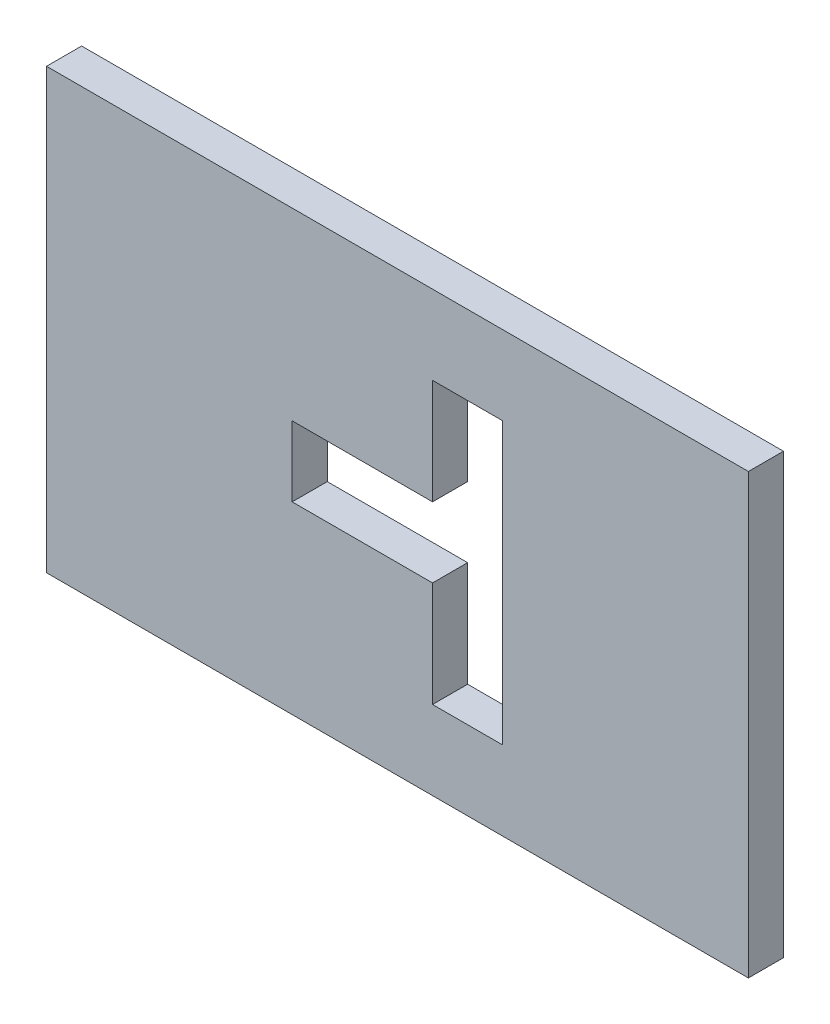
ISO-10303-21;
HEADER;
FILE_DESCRIPTION(('STEP AP214'),'2;1');
FILE_NAME('part.step','',(''),(''),'','','');
FILE_SCHEMA(('AUTOMOTIVE_DESIGN { 1 0 10303 214 1 1 1 1 }'));
ENDSEC;
DATA;
#1=APPLICATION_CONTEXT('core data for automotive mechanical design processes');
#2=APPLICATION_PROTOCOL_DEFINITION('international standard','automotive_design',2000,#1);
#3=PRODUCT_CONTEXT('',#1,'mechanical');
#4=PRODUCT('Part','Part','',(#3));
#5=PRODUCT_RELATED_PRODUCT_CATEGORY('part','',(#4));
#6=PRODUCT_DEFINITION_FORMATION('','',#4);
#7=PRODUCT_DEFINITION_CONTEXT('part definition',#1,'design');
#8=PRODUCT_DEFINITION('design','',#6,#7);
#9=PRODUCT_DEFINITION_SHAPE('','',#8);
#10=(LENGTH_UNIT() NAMED_UNIT(*) SI_UNIT(.MILLI.,.METRE.));
#11=(NAMED_UNIT(*) PLANE_ANGLE_UNIT() SI_UNIT($,.RADIAN.));
#12=(NAMED_UNIT(*) SI_UNIT($,.STERADIAN.) SOLID_ANGLE_UNIT());
#13=UNCERTAINTY_MEASURE_WITH_UNIT(LENGTH_MEASURE(1.E-05),#10,'distance_accuracy_value','');
#14=(GEOMETRIC_REPRESENTATION_CONTEXT(3) GLOBAL_UNCERTAINTY_ASSIGNED_CONTEXT((#13)) GLOBAL_UNIT_ASSIGNED_CONTEXT((#10,
#11,#12)) REPRESENTATION_CONTEXT('',''));
#15=CARTESIAN_POINT('',(0.,0.,0.));
#16=DIRECTION('',(0.,0.,1.));
#17=DIRECTION('',(1.,0.,0.));
#18=AXIS2_PLACEMENT_3D('',#15,#16,#17);
#19=CARTESIAN_POINT('',(1.00000054,-0.62500002,0.0999998));
#20=DIRECTION('',(0.,0.,1.));
#21=DIRECTION('',(1.,0.,0.));
#22=AXIS2_PLACEMENT_3D('',#19,#20,#21);
#23=PLANE('',#22);
#24=DIRECTION('',(0.,1.,0.));
#25=VECTOR('',#24,1.);
#26=CARTESIAN_POINT('',(-1.00000054,-0.62500002,0.0999998));
#27=LINE('',#26,#25);
#28=CARTESIAN_POINT('',(-1.00000054,-0.62500002,0.0999998));
#29=VERTEX_POINT('',#28);
#30=CARTESIAN_POINT('',(-1.00000054,0.62500002,0.0999998));
#31=VERTEX_POINT('',#30);
#32=EDGE_CURVE('E157',#29,#31,#27,.T.);
#33=ORIENTED_EDGE('',*,*,#32,.F.);
#34=DIRECTION('',(1.,0.,0.));
#35=VECTOR('',#34,1.);
#36=CARTESIAN_POINT('',(1.00000054,-0.62500002,0.0999998));
#37=LINE('',#36,#35);
#38=CARTESIAN_POINT('',(1.00000054,-0.62500002,0.0999998));
#39=VERTEX_POINT('',#38);
#40=EDGE_CURVE('E164',#39,#29,#37,.F.);
#41=ORIENTED_EDGE('',*,*,#40,.F.);
#42=DIRECTION('',(0.,1.,0.));
#43=VECTOR('',#42,1.);
#44=CARTESIAN_POINT('',(1.00000054,0.62500002,0.0999998));
#45=LINE('',#44,#43);
#46=CARTESIAN_POINT('',(1.00000054,0.62500002,0.0999998));
#47=VERTEX_POINT('',#46);
#48=EDGE_CURVE('E150',#47,#39,#45,.F.);
#49=ORIENTED_EDGE('',*,*,#48,.F.);
#50=DIRECTION('',(1.,0.,0.));
#51=VECTOR('',#50,1.);
#52=CARTESIAN_POINT('',(-1.00000054,0.62500002,0.0999998));
#53=LINE('',#52,#51);
#54=EDGE_CURVE('E152',#31,#47,#53,.T.);
#55=ORIENTED_EDGE('',*,*,#54,.F.);
#56=EDGE_LOOP('',(#33,#41,#49,#55));
#57=FACE_BOUND('',#56,.T.);
#58=DIRECTION('',(1.,0.,0.));
#59=VECTOR('',#58,1.);
#60=CARTESIAN_POINT('',(0.2999994,0.3999992,0.0999998));
#61=LINE('',#60,#59);
#62=CARTESIAN_POINT('',(0.2999994,0.3999992,0.0999998));
#63=VERTEX_POINT('',#62);
#64=CARTESIAN_POINT('',(0.09999980000001,0.3999992,0.0999998));
#65=VERTEX_POINT('',#64);
#66=EDGE_CURVE('E111',#63,#65,#61,.F.);
#67=ORIENTED_EDGE('',*,*,#66,.F.);
#68=DIRECTION('',(0.,1.,0.));
#69=VECTOR('',#68,1.);
#70=CARTESIAN_POINT('',(0.2999994,0.,0.0999998));
#71=LINE('',#70,#69);
#72=CARTESIAN_POINT('',(0.2999994,-0.3999992,0.0999998));
#73=VERTEX_POINT('',#72);
#74=EDGE_CURVE('E107',#73,#63,#71,.T.);
#75=ORIENTED_EDGE('',*,*,#74,.F.);
#76=DIRECTION('',(1.,0.,0.));
#77=VECTOR('',#76,1.);
#78=CARTESIAN_POINT('',(0.09999980000001,-0.3999992,0.0999998));
#79=LINE('',#78,#77);
#80=CARTESIAN_POINT('',(0.09999980000001,-0.3999992,0.0999998));
#81=VERTEX_POINT('',#80);
#82=EDGE_CURVE('E20',#81,#73,#79,.T.);
#83=ORIENTED_EDGE('',*,*,#82,.F.);
#84=DIRECTION('',(0.,1.,0.));
#85=VECTOR('',#84,1.);
#86=CARTESIAN_POINT('',(0.09999980000001,-0.09999980000001,0.0999998));
#87=LINE('',#86,#85);
#88=CARTESIAN_POINT('',(0.09999980000001,-0.09999980000001,0.0999998));
#89=VERTEX_POINT('',#88);
#90=EDGE_CURVE('E102',#89,#81,#87,.F.);
#91=ORIENTED_EDGE('',*,*,#90,.F.);
#92=DIRECTION('',(1.,0.,0.));
#93=VECTOR('',#92,1.);
#94=CARTESIAN_POINT('',(-0.2999994,-0.09999980000001,0.0999998));
#95=LINE('',#94,#93);
#96=CARTESIAN_POINT('',(-0.2999994,-0.09999980000001,0.0999998));
#97=VERTEX_POINT('',#96);
#98=EDGE_CURVE('E131',#97,#89,#95,.T.);
#99=ORIENTED_EDGE('',*,*,#98,.F.);
#100=DIRECTION('',(0.,1.,0.));
#101=VECTOR('',#100,1.);
#102=CARTESIAN_POINT('',(-0.2999994,0.09999979999999,0.0999998));
#103=LINE('',#102,#101);
#104=CARTESIAN_POINT('',(-0.2999994,0.09999979999999,0.0999998));
#105=VERTEX_POINT('',#104);
#106=EDGE_CURVE('E135',#105,#97,#103,.F.);
#107=ORIENTED_EDGE('',*,*,#106,.F.);
#108=DIRECTION('',(1.,0.,0.));
#109=VECTOR('',#108,1.);
#110=CARTESIAN_POINT('',(0.09999980000001,0.09999979999999,0.0999998));
#111=LINE('',#110,#109);
#112=CARTESIAN_POINT('',(0.09999980000001,0.09999979999999,0.0999998));
#113=VERTEX_POINT('',#112);
#114=EDGE_CURVE('E139',#113,#105,#111,.F.);
#115=ORIENTED_EDGE('',*,*,#114,.F.);
#116=DIRECTION('',(0.,1.,0.));
#117=VECTOR('',#116,1.);
#118=CARTESIAN_POINT('',(0.09999980000001,0.3999992,0.0999998));
#119=LINE('',#118,#117);
#120=EDGE_CURVE('E143',#65,#113,#119,.F.);
#121=ORIENTED_EDGE('',*,*,#120,.F.);
#122=EDGE_LOOP('',(#67,#75,#83,#91,#99,#107,#115,#121));
#123=FACE_BOUND('',#122,.T.);
#124=ADVANCED_FACE('F17',(#57,#123),#23,.T.);
#125=CARTESIAN_POINT('',(0.09999980000001,-0.3999992,0.));
#126=DIRECTION('',(0.,1.,0.));
#127=DIRECTION('',(0.,0.,1.));
#128=AXIS2_PLACEMENT_3D('',#125,#126,#127);
#129=PLANE('',#128);
#130=DIRECTION('',(0.,0.,1.));
#131=VECTOR('',#130,1.);
#132=CARTESIAN_POINT('',(0.2999994,-0.3999992,0.));
#133=LINE('',#132,#131);
#134=CARTESIAN_POINT('',(0.2999994,-0.3999992,0.));
#135=VERTEX_POINT('',#134);
#136=EDGE_CURVE('E122',#73,#135,#133,.F.);
#137=ORIENTED_EDGE('',*,*,#136,.T.);
#138=DIRECTION('',(1.,0.,0.));
#139=VECTOR('',#138,1.);
#140=CARTESIAN_POINT('',(1.00000054,-0.3999992,0.));
#141=LINE('',#140,#139);
#142=CARTESIAN_POINT('',(0.09999980000001,-0.3999992,0.));
#143=VERTEX_POINT('',#142);
#144=EDGE_CURVE('E168',#135,#143,#141,.F.);
#145=ORIENTED_EDGE('',*,*,#144,.T.);
#146=DIRECTION('',(0.,0.,-1.));
#147=VECTOR('',#146,1.);
#148=CARTESIAN_POINT('',(0.09999980000001,-0.3999992,0.));
#149=LINE('',#148,#147);
#150=EDGE_CURVE('E124',#81,#143,#149,.T.);
#151=ORIENTED_EDGE('',*,*,#150,.F.);
#152=ORIENTED_EDGE('',*,*,#82,.T.);
#153=EDGE_LOOP('',(#137,#145,#151,#152));
#154=FACE_BOUND('',#153,.T.);
#155=ADVANCED_FACE('F120',(#154),#129,.T.);
#156=CARTESIAN_POINT('',(0.09999980000001,-0.09999980000001,0.));
#157=DIRECTION('',(1.,0.,0.));
#158=DIRECTION('',(0.,0.,-1.));
#159=AXIS2_PLACEMENT_3D('',#156,#157,#158);
#160=PLANE('',#159);
#161=ORIENTED_EDGE('',*,*,#150,.T.);
#162=DIRECTION('',(0.,1.,0.));
#163=VECTOR('',#162,1.);
#164=CARTESIAN_POINT('',(0.09999980000001,-0.62500002,0.));
#165=LINE('',#164,#163);
#166=CARTESIAN_POINT('',(0.09999980000001,-0.09999980000001,0.));
#167=VERTEX_POINT('',#166);
#168=EDGE_CURVE('E170',#143,#167,#165,.T.);
#169=ORIENTED_EDGE('',*,*,#168,.T.);
#170=DIRECTION('',(0.,0.,1.));
#171=VECTOR('',#170,1.);
#172=CARTESIAN_POINT('',(0.09999980000001,-0.09999980000001,0.));
#173=LINE('',#172,#171);
#174=EDGE_CURVE('E133',#89,#167,#173,.F.);
#175=ORIENTED_EDGE('',*,*,#174,.F.);
#176=ORIENTED_EDGE('',*,*,#90,.T.);
#177=EDGE_LOOP('',(#161,#169,#175,#176));
#178=FACE_BOUND('',#177,.T.);
#179=ADVANCED_FACE('F247',(#178),#160,.T.);
#180=CARTESIAN_POINT('',(-0.2999994,-0.09999980000001,0.));
#181=DIRECTION('',(0.,1.,0.));
#182=DIRECTION('',(0.,0.,1.));
#183=AXIS2_PLACEMENT_3D('',#180,#181,#182);
#184=PLANE('',#183);
#185=ORIENTED_EDGE('',*,*,#174,.T.);
#186=DIRECTION('',(1.,0.,0.));
#187=VECTOR('',#186,1.);
#188=CARTESIAN_POINT('',(1.00000054,-0.09999980000001,0.));
#189=LINE('',#188,#187);
#190=CARTESIAN_POINT('',(-0.2999994,-0.09999980000001,0.));
#191=VERTEX_POINT('',#190);
#192=EDGE_CURVE('E173',#167,#191,#189,.F.);
#193=ORIENTED_EDGE('',*,*,#192,.T.);
#194=DIRECTION('',(0.,0.,-1.));
#195=VECTOR('',#194,1.);
#196=CARTESIAN_POINT('',(-0.2999994,-0.09999980000001,0.));
#197=LINE('',#196,#195);
#198=EDGE_CURVE('E137',#97,#191,#197,.T.);
#199=ORIENTED_EDGE('',*,*,#198,.F.);
#200=ORIENTED_EDGE('',*,*,#98,.T.);
#201=EDGE_LOOP('',(#185,#193,#199,#200));
#202=FACE_BOUND('',#201,.T.);
#203=ADVANCED_FACE('F243',(#202),#184,.T.);
#204=CARTESIAN_POINT('',(-0.2999994,0.09999979999999,0.));
#205=DIRECTION('',(1.,0.,0.));
#206=DIRECTION('',(0.,0.,-1.));
#207=AXIS2_PLACEMENT_3D('',#204,#205,#206);
#208=PLANE('',#207);
#209=ORIENTED_EDGE('',*,*,#198,.T.);
#210=DIRECTION('',(0.,1.,0.));
#211=VECTOR('',#210,1.);
#212=CARTESIAN_POINT('',(-0.2999994,-0.62500002,0.));
#213=LINE('',#212,#211);
#214=CARTESIAN_POINT('',(-0.2999994,0.09999979999999,0.));
#215=VERTEX_POINT('',#214);
#216=EDGE_CURVE('E176',#191,#215,#213,.T.);
#217=ORIENTED_EDGE('',*,*,#216,.T.);
#218=DIRECTION('',(0.,0.,-1.));
#219=VECTOR('',#218,1.);
#220=CARTESIAN_POINT('',(-0.2999994,0.09999979999999,0.));
#221=LINE('',#220,#219);
#222=EDGE_CURVE('E141',#105,#215,#221,.T.);
#223=ORIENTED_EDGE('',*,*,#222,.F.);
#224=ORIENTED_EDGE('',*,*,#106,.T.);
#225=EDGE_LOOP('',(#209,#217,#223,#224));
#226=FACE_BOUND('',#225,.T.);
#227=ADVANCED_FACE('F239',(#226),#208,.T.);
#228=CARTESIAN_POINT('',(0.09999980000001,0.09999979999999,0.));
#229=DIRECTION('',(0.,-1.,0.));
#230=DIRECTION('',(0.,0.,-1.));
#231=AXIS2_PLACEMENT_3D('',#228,#229,#230);
#232=PLANE('',#231);
#233=ORIENTED_EDGE('',*,*,#222,.T.);
#234=DIRECTION('',(1.,0.,0.));
#235=VECTOR('',#234,1.);
#236=CARTESIAN_POINT('',(1.00000054,0.09999979999999,0.));
#237=LINE('',#236,#235);
#238=CARTESIAN_POINT('',(0.09999980000001,0.09999979999999,0.));
#239=VERTEX_POINT('',#238);
#240=EDGE_CURVE('E179',#215,#239,#237,.T.);
#241=ORIENTED_EDGE('',*,*,#240,.T.);
#242=DIRECTION('',(0.,0.,-1.));
#243=VECTOR('',#242,1.);
#244=CARTESIAN_POINT('',(0.09999980000001,0.09999979999999,0.));
#245=LINE('',#244,#243);
#246=EDGE_CURVE('E145',#113,#239,#245,.T.);
#247=ORIENTED_EDGE('',*,*,#246,.F.);
#248=ORIENTED_EDGE('',*,*,#114,.T.);
#249=EDGE_LOOP('',(#233,#241,#247,#248));
#250=FACE_BOUND('',#249,.T.);
#251=ADVANCED_FACE('F235',(#250),#232,.T.);
#252=CARTESIAN_POINT('',(0.09999980000001,0.3999992,0.));
#253=DIRECTION('',(1.,0.,0.));
#254=DIRECTION('',(0.,0.,-1.));
#255=AXIS2_PLACEMENT_3D('',#252,#253,#254);
#256=PLANE('',#255);
#257=ORIENTED_EDGE('',*,*,#246,.T.);
#258=DIRECTION('',(0.,1.,0.));
#259=VECTOR('',#258,1.);
#260=CARTESIAN_POINT('',(0.09999980000001,-0.62500002,0.));
#261=LINE('',#260,#259);
#262=CARTESIAN_POINT('',(0.09999980000001,0.3999992,0.));
#263=VERTEX_POINT('',#262);
#264=EDGE_CURVE('E182',#239,#263,#261,.T.);
#265=ORIENTED_EDGE('',*,*,#264,.T.);
#266=DIRECTION('',(0.,0.,-1.));
#267=VECTOR('',#266,1.);
#268=CARTESIAN_POINT('',(0.09999980000001,0.3999992,0.));
#269=LINE('',#268,#267);
#270=EDGE_CURVE('E117',#65,#263,#269,.T.);
#271=ORIENTED_EDGE('',*,*,#270,.F.);
#272=ORIENTED_EDGE('',*,*,#120,.T.);
#273=EDGE_LOOP('',(#257,#265,#271,#272));
#274=FACE_BOUND('',#273,.T.);
#275=ADVANCED_FACE('F231',(#274),#256,.T.);
#276=CARTESIAN_POINT('',(0.2999994,0.3999992,0.));
#277=DIRECTION('',(0.,-1.,0.));
#278=DIRECTION('',(0.,0.,-1.));
#279=AXIS2_PLACEMENT_3D('',#276,#277,#278);
#280=PLANE('',#279);
#281=ORIENTED_EDGE('',*,*,#270,.T.);
#282=DIRECTION('',(1.,0.,0.));
#283=VECTOR('',#282,1.);
#284=CARTESIAN_POINT('',(1.00000054,0.3999992,0.));
#285=LINE('',#284,#283);
#286=CARTESIAN_POINT('',(0.2999994,0.3999992,0.));
#287=VERTEX_POINT('',#286);
#288=EDGE_CURVE('E185',#263,#287,#285,.T.);
#289=ORIENTED_EDGE('',*,*,#288,.T.);
#290=DIRECTION('',(0.,0.,1.));
#291=VECTOR('',#290,1.);
#292=CARTESIAN_POINT('',(0.2999994,0.3999992,0.));
#293=LINE('',#292,#291);
#294=EDGE_CURVE('E116',#63,#287,#293,.F.);
#295=ORIENTED_EDGE('',*,*,#294,.F.);
#296=ORIENTED_EDGE('',*,*,#66,.T.);
#297=EDGE_LOOP('',(#281,#289,#295,#296));
#298=FACE_BOUND('',#297,.T.);
#299=ADVANCED_FACE('F228',(#298),#280,.T.);
#300=CARTESIAN_POINT('',(0.2999994,0.,0.));
#301=DIRECTION('',(-1.,0.,0.));
#302=DIRECTION('',(0.,0.,1.));
#303=AXIS2_PLACEMENT_3D('',#300,#301,#302);
#304=PLANE('',#303);
#305=ORIENTED_EDGE('',*,*,#294,.T.);
#306=DIRECTION('',(0.,1.,0.));
#307=VECTOR('',#306,1.);
#308=CARTESIAN_POINT('',(0.2999994,-0.62500002,0.));
#309=LINE('',#308,#307);
#310=EDGE_CURVE('E127',#287,#135,#309,.F.);
#311=ORIENTED_EDGE('',*,*,#310,.T.);
#312=ORIENTED_EDGE('',*,*,#136,.F.);
#313=ORIENTED_EDGE('',*,*,#74,.T.);
#314=EDGE_LOOP('',(#305,#311,#312,#313));
#315=FACE_BOUND('',#314,.T.);
#316=ADVANCED_FACE('F126',(#315),#304,.T.);
#317=CARTESIAN_POINT('',(1.00000054,0.62500002,0.));
#318=DIRECTION('',(1.,0.,0.));
#319=DIRECTION('',(0.,0.,-1.));
#320=AXIS2_PLACEMENT_3D('',#317,#318,#319);
#321=PLANE('',#320);
#322=ORIENTED_EDGE('',*,*,#48,.T.);
#323=DIRECTION('',(0.,0.,-1.));
#324=VECTOR('',#323,1.);
#325=CARTESIAN_POINT('',(1.00000054,-0.62500002,0.));
#326=LINE('',#325,#324);
#327=CARTESIAN_POINT('',(1.00000054,-0.62500002,0.));
#328=VERTEX_POINT('',#327);
#329=EDGE_CURVE('E161',#328,#39,#326,.F.);
#330=ORIENTED_EDGE('',*,*,#329,.F.);
#331=DIRECTION('',(0.,1.,0.));
#332=VECTOR('',#331,1.);
#333=CARTESIAN_POINT('',(1.00000054,-0.62500002,0.));
#334=LINE('',#333,#332);
#335=CARTESIAN_POINT('',(1.00000054,0.62500002,0.));
#336=VERTEX_POINT('',#335);
#337=EDGE_CURVE('E188',#328,#336,#334,.T.);
#338=ORIENTED_EDGE('',*,*,#337,.T.);
#339=DIRECTION('',(0.,0.,1.));
#340=VECTOR('',#339,1.);
#341=CARTESIAN_POINT('',(1.00000054,0.62500002,0.));
#342=LINE('',#341,#340);
#343=EDGE_CURVE('E154',#47,#336,#342,.F.);
#344=ORIENTED_EDGE('',*,*,#343,.F.);
#345=EDGE_LOOP('',(#322,#330,#338,#344));
#346=FACE_BOUND('',#345,.T.);
#347=ADVANCED_FACE('F208',(#346),#321,.T.);
#348=CARTESIAN_POINT('',(-1.00000054,0.62500002,0.));
#349=DIRECTION('',(0.,1.,0.));
#350=DIRECTION('',(0.,0.,1.));
#351=AXIS2_PLACEMENT_3D('',#348,#349,#350);
#352=PLANE('',#351);
#353=ORIENTED_EDGE('',*,*,#343,.T.);
#354=DIRECTION('',(1.,0.,0.));
#355=VECTOR('',#354,1.);
#356=CARTESIAN_POINT('',(1.00000054,0.62500002,0.));
#357=LINE('',#356,#355);
#358=CARTESIAN_POINT('',(-1.00000054,0.62500002,0.));
#359=VERTEX_POINT('',#358);
#360=EDGE_CURVE('E190',#336,#359,#357,.F.);
#361=ORIENTED_EDGE('',*,*,#360,.T.);
#362=DIRECTION('',(0.,0.,1.));
#363=VECTOR('',#362,1.);
#364=CARTESIAN_POINT('',(-1.00000054,0.62500002,0.));
#365=LINE('',#364,#363);
#366=EDGE_CURVE('E159',#31,#359,#365,.F.);
#367=ORIENTED_EDGE('',*,*,#366,.F.);
#368=ORIENTED_EDGE('',*,*,#54,.T.);
#369=EDGE_LOOP('',(#353,#361,#367,#368));
#370=FACE_BOUND('',#369,.T.);
#371=ADVANCED_FACE('F203',(#370),#352,.T.);
#372=CARTESIAN_POINT('',(-1.00000054,-0.62500002,0.));
#373=DIRECTION('',(-1.,0.,0.));
#374=DIRECTION('',(0.,0.,1.));
#375=AXIS2_PLACEMENT_3D('',#372,#373,#374);
#376=PLANE('',#375);
#377=ORIENTED_EDGE('',*,*,#366,.T.);
#378=DIRECTION('',(0.,1.,0.));
#379=VECTOR('',#378,1.);
#380=CARTESIAN_POINT('',(-1.00000054,-0.62500002,0.));
#381=LINE('',#380,#379);
#382=CARTESIAN_POINT('',(-1.00000054,-0.62500002,0.));
#383=VERTEX_POINT('',#382);
#384=EDGE_CURVE('E26',#359,#383,#381,.F.);
#385=ORIENTED_EDGE('',*,*,#384,.T.);
#386=DIRECTION('',(0.,0.,-1.));
#387=VECTOR('',#386,1.);
#388=CARTESIAN_POINT('',(-1.00000054,-0.62500002,0.));
#389=LINE('',#388,#387);
#390=EDGE_CURVE('E34',#29,#383,#389,.T.);
#391=ORIENTED_EDGE('',*,*,#390,.F.);
#392=ORIENTED_EDGE('',*,*,#32,.T.);
#393=EDGE_LOOP('',(#377,#385,#391,#392));
#394=FACE_BOUND('',#393,.T.);
#395=ADVANCED_FACE('F196',(#394),#376,.T.);
#396=CARTESIAN_POINT('',(1.00000054,-0.62500002,0.));
#397=DIRECTION('',(0.,-1.,0.));
#398=DIRECTION('',(0.,0.,-1.));
#399=AXIS2_PLACEMENT_3D('',#396,#397,#398);
#400=PLANE('',#399);
#401=ORIENTED_EDGE('',*,*,#390,.T.);
#402=DIRECTION('',(1.,0.,0.));
#403=VECTOR('',#402,1.);
#404=CARTESIAN_POINT('',(1.00000054,-0.62500002,0.));
#405=LINE('',#404,#403);
#406=EDGE_CURVE('E11',#383,#328,#405,.T.);
#407=ORIENTED_EDGE('',*,*,#406,.T.);
#408=ORIENTED_EDGE('',*,*,#329,.T.);
#409=ORIENTED_EDGE('',*,*,#40,.T.);
#410=EDGE_LOOP('',(#401,#407,#408,#409));
#411=FACE_BOUND('',#410,.T.);
#412=ADVANCED_FACE('F211',(#411),#400,.T.);
#413=CARTESIAN_POINT('',(1.00000054,-0.62500002,0.));
#414=DIRECTION('',(0.,0.,1.));
#415=DIRECTION('',(1.,0.,0.));
#416=AXIS2_PLACEMENT_3D('',#413,#414,#415);
#417=PLANE('',#416);
#418=ORIENTED_EDGE('',*,*,#384,.F.);
#419=ORIENTED_EDGE('',*,*,#360,.F.);
#420=ORIENTED_EDGE('',*,*,#337,.F.);
#421=ORIENTED_EDGE('',*,*,#406,.F.);
#422=EDGE_LOOP('',(#418,#419,#420,#421));
#423=FACE_BOUND('',#422,.T.);
#424=ORIENTED_EDGE('',*,*,#288,.F.);
#425=ORIENTED_EDGE('',*,*,#264,.F.);
#426=ORIENTED_EDGE('',*,*,#240,.F.);
#427=ORIENTED_EDGE('',*,*,#216,.F.);
#428=ORIENTED_EDGE('',*,*,#192,.F.);
#429=ORIENTED_EDGE('',*,*,#168,.F.);
#430=ORIENTED_EDGE('',*,*,#144,.F.);
#431=ORIENTED_EDGE('',*,*,#310,.F.);
#432=EDGE_LOOP('',(#424,#425,#426,#427,#428,#429,#430,#431));
#433=FACE_BOUND('',#432,.T.);
#434=ADVANCED_FACE('F200',(#423,#433),#417,.F.);
#435=CLOSED_SHELL('',(#124,#155,#179,#203,#227,#251,#275,#299,#316,#347,#371,#395,#412,#434));
#436=MANIFOLD_SOLID_BREP('B1',#435);
#437=ADVANCED_BREP_SHAPE_REPRESENTATION('',(#18,#436),#14);
#438=SHAPE_DEFINITION_REPRESENTATION(#9,#437);
ENDSEC;
END-ISO-10303-21;
